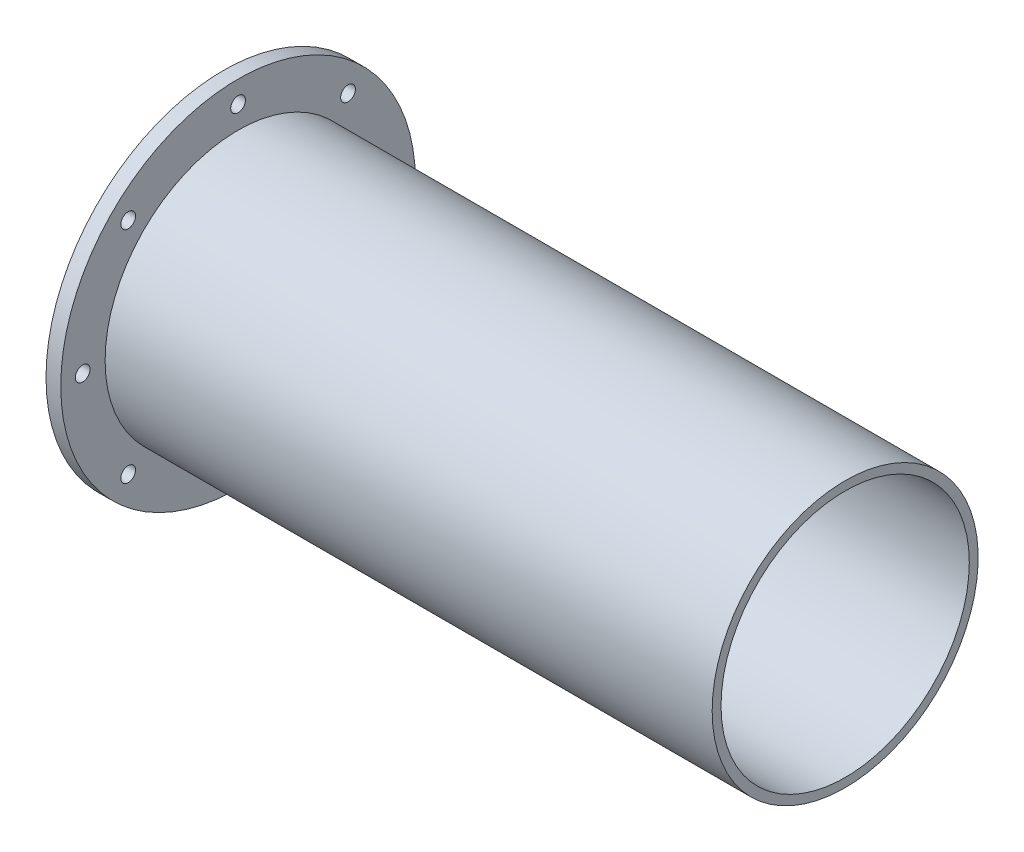
ISO-10303-21;
HEADER;
FILE_DESCRIPTION(('STEP AP214'),'2;1');
FILE_NAME('part.step','',(''),(''),'','','');
FILE_SCHEMA(('AUTOMOTIVE_DESIGN { 1 0 10303 214 1 1 1 1 }'));
ENDSEC;
DATA;
#1=APPLICATION_CONTEXT('core data for automotive mechanical design processes');
#2=APPLICATION_PROTOCOL_DEFINITION('international standard','automotive_design',2000,#1);
#3=PRODUCT_CONTEXT('',#1,'mechanical');
#4=PRODUCT('Part','Part','',(#3));
#5=PRODUCT_RELATED_PRODUCT_CATEGORY('part','',(#4));
#6=PRODUCT_DEFINITION_FORMATION('','',#4);
#7=PRODUCT_DEFINITION_CONTEXT('part definition',#1,'design');
#8=PRODUCT_DEFINITION('design','',#6,#7);
#9=PRODUCT_DEFINITION_SHAPE('','',#8);
#10=(LENGTH_UNIT() NAMED_UNIT(*) SI_UNIT(.MILLI.,.METRE.));
#11=(NAMED_UNIT(*) PLANE_ANGLE_UNIT() SI_UNIT($,.RADIAN.));
#12=(NAMED_UNIT(*) SI_UNIT($,.STERADIAN.) SOLID_ANGLE_UNIT());
#13=UNCERTAINTY_MEASURE_WITH_UNIT(LENGTH_MEASURE(1.E-05),#10,'distance_accuracy_value','');
#14=(GEOMETRIC_REPRESENTATION_CONTEXT(3) GLOBAL_UNCERTAINTY_ASSIGNED_CONTEXT((#13)) GLOBAL_UNIT_ASSIGNED_CONTEXT((#10,
#11,#12)) REPRESENTATION_CONTEXT('',''));
#15=CARTESIAN_POINT('',(0.,0.,0.));
#16=DIRECTION('',(0.,0.,1.));
#17=DIRECTION('',(1.,0.,0.));
#18=AXIS2_PLACEMENT_3D('',#15,#16,#17);
#19=CARTESIAN_POINT('',(0.,76.2,0.));
#20=DIRECTION('',(1.,0.,0.));
#21=DIRECTION('',(0.,0.,-1.));
#22=AXIS2_PLACEMENT_3D('',#19,#20,#21);
#23=PLANE('',#22);
#24=CARTESIAN_POINT('',(0.,-66.802,2.33237936397399E-13));
#25=DIRECTION('',(1.,0.,0.));
#26=DIRECTION('',(0.,-1.,0.));
#27=AXIS2_PLACEMENT_3D('',#24,#25,#26);
#28=CIRCLE('',#27,3.175);
#29=CARTESIAN_POINT('',(0.,-69.977,2.44323389648226E-13));
#30=VERTEX_POINT('',#29);
#31=EDGE_CURVE('E70',#30,#30,#28,.T.);
#32=ORIENTED_EDGE('',*,*,#31,.T.);
#33=EDGE_LOOP('',(#32));
#34=FACE_BOUND('',#33,.T.);
#35=CARTESIAN_POINT('',(0.,-47.2361471968235,47.236147196824));
#36=DIRECTION('',(1.,0.,0.));
#37=DIRECTION('',(0.,-0.707106781186544,0.707106781186551));
#38=AXIS2_PLACEMENT_3D('',#35,#36,#37);
#39=CIRCLE('',#38,3.175);
#40=CARTESIAN_POINT('',(0.,-49.4812112270908,49.4812112270913));
#41=VERTEX_POINT('',#40);
#42=EDGE_CURVE('E89',#41,#41,#39,.T.);
#43=ORIENTED_EDGE('',*,*,#42,.T.);
#44=EDGE_LOOP('',(#43));
#45=FACE_BOUND('',#44,.T.);
#46=CARTESIAN_POINT('',(0.,0.,66.802));
#47=DIRECTION('',(1.,0.,0.));
#48=DIRECTION('',(0.,0.,1.));
#49=AXIS2_PLACEMENT_3D('',#46,#47,#48);
#50=CIRCLE('',#49,3.175);
#51=CARTESIAN_POINT('',(0.,0.,69.977));
#52=VERTEX_POINT('',#51);
#53=EDGE_CURVE('E83',#52,#52,#50,.T.);
#54=ORIENTED_EDGE('',*,*,#53,.T.);
#55=EDGE_LOOP('',(#54));
#56=FACE_BOUND('',#55,.T.);
#57=CARTESIAN_POINT('',(0.,47.2361471968242,47.2361471968233));
#58=DIRECTION('',(1.,0.,0.));
#59=DIRECTION('',(0.,0.707106781186554,0.707106781186541));
#60=AXIS2_PLACEMENT_3D('',#57,#58,#59);
#61=CIRCLE('',#60,3.175);
#62=CARTESIAN_POINT('',(0.,49.4812112270915,49.4812112270906));
#63=VERTEX_POINT('',#62);
#64=EDGE_CURVE('E76',#63,#63,#61,.T.);
#65=ORIENTED_EDGE('',*,*,#64,.T.);
#66=EDGE_LOOP('',(#65));
#67=FACE_BOUND('',#66,.T.);
#68=CARTESIAN_POINT('',(0.,66.802,-6.99713809192197E-13));
#69=DIRECTION('',(1.,0.,0.));
#70=DIRECTION('',(0.,1.,0.));
#71=AXIS2_PLACEMENT_3D('',#68,#69,#70);
#72=CIRCLE('',#71,3.175);
#73=CARTESIAN_POINT('',(0.,69.977,-7.32970168944678E-13));
#74=VERTEX_POINT('',#73);
#75=EDGE_CURVE('E77',#74,#74,#72,.T.);
#76=ORIENTED_EDGE('',*,*,#75,.T.);
#77=EDGE_LOOP('',(#76));
#78=FACE_BOUND('',#77,.T.);
#79=CARTESIAN_POINT('',(0.,47.2361471968232,-47.2361471968243));
#80=DIRECTION('',(1.,0.,0.));
#81=DIRECTION('',(0.,0.707106781186539,-0.707106781186556));
#82=AXIS2_PLACEMENT_3D('',#79,#80,#81);
#83=CIRCLE('',#82,3.175);
#84=CARTESIAN_POINT('',(0.,49.4812112270904,-49.4812112270916));
#85=VERTEX_POINT('',#84);
#86=EDGE_CURVE('E100',#85,#85,#83,.T.);
#87=ORIENTED_EDGE('',*,*,#86,.T.);
#88=EDGE_LOOP('',(#87));
#89=FACE_BOUND('',#88,.T.);
#90=CARTESIAN_POINT('',(0.,-47.2361471968238,-47.2361471968237));
#91=DIRECTION('',(1.,0.,0.));
#92=DIRECTION('',(0.,-0.707106781186549,-0.707106781186546));
#93=AXIS2_PLACEMENT_3D('',#90,#91,#92);
#94=CIRCLE('',#93,3.175);
#95=CARTESIAN_POINT('',(0.,-49.4812112270911,-49.481211227091));
#96=VERTEX_POINT('',#95);
#97=EDGE_CURVE('E64',#96,#96,#94,.T.);
#98=ORIENTED_EDGE('',*,*,#97,.T.);
#99=EDGE_LOOP('',(#98));
#100=FACE_BOUND('',#99,.T.);
#101=CARTESIAN_POINT('',(0.,0.,-66.802));
#102=DIRECTION('',(1.,0.,0.));
#103=DIRECTION('',(0.,0.,-1.));
#104=AXIS2_PLACEMENT_3D('',#101,#102,#103);
#105=CIRCLE('',#104,3.175);
#106=CARTESIAN_POINT('',(0.,0.,-69.977));
#107=VERTEX_POINT('',#106);
#108=EDGE_CURVE('E60',#107,#107,#105,.T.);
#109=ORIENTED_EDGE('',*,*,#108,.T.);
#110=EDGE_LOOP('',(#109));
#111=FACE_BOUND('',#110,.T.);
#112=CARTESIAN_POINT('',(0.,0.,0.));
#113=DIRECTION('',(-1.,0.,0.));
#114=DIRECTION('',(0.,0.,1.));
#115=AXIS2_PLACEMENT_3D('',#112,#113,#114);
#116=CIRCLE('',#115,53.34);
#117=CARTESIAN_POINT('',(0.,0.,53.34));
#118=VERTEX_POINT('',#117);
#119=EDGE_CURVE('E57',#118,#118,#116,.T.);
#120=ORIENTED_EDGE('',*,*,#119,.F.);
#121=EDGE_LOOP('',(#120));
#122=FACE_BOUND('',#121,.T.);
#123=CARTESIAN_POINT('',(0.,0.,0.));
#124=DIRECTION('',(-1.,0.,0.));
#125=DIRECTION('',(0.,0.,1.));
#126=AXIS2_PLACEMENT_3D('',#123,#124,#125);
#127=CIRCLE('',#126,76.2);
#128=CARTESIAN_POINT('',(0.,0.,76.2));
#129=VERTEX_POINT('',#128);
#130=EDGE_CURVE('E10',#129,#129,#127,.T.);
#131=ORIENTED_EDGE('',*,*,#130,.T.);
#132=EDGE_LOOP('',(#131));
#133=FACE_BOUND('',#132,.T.);
#134=ADVANCED_FACE('F35',(#34,#45,#56,#67,#78,#89,#100,#111,#122,#133),#23,.F.);
#135=CARTESIAN_POINT('',(0.,0.,0.));
#136=DIRECTION('',(-1.,0.,0.));
#137=DIRECTION('',(0.,0.,1.));
#138=AXIS2_PLACEMENT_3D('',#135,#136,#137);
#139=CYLINDRICAL_SURFACE('',#138,76.2);
#140=ORIENTED_EDGE('',*,*,#130,.F.);
#141=EDGE_LOOP('',(#140));
#142=FACE_BOUND('',#141,.T.);
#143=CARTESIAN_POINT('',(6.35000000000001,0.,0.));
#144=DIRECTION('',(-1.,0.,0.));
#145=DIRECTION('',(0.,0.,1.));
#146=AXIS2_PLACEMENT_3D('',#143,#144,#145);
#147=CIRCLE('',#146,76.2);
#148=CARTESIAN_POINT('',(6.35000000000001,0.,76.2));
#149=VERTEX_POINT('',#148);
#150=EDGE_CURVE('E41',#149,#149,#147,.T.);
#151=ORIENTED_EDGE('',*,*,#150,.T.);
#152=EDGE_LOOP('',(#151));
#153=FACE_BOUND('',#152,.T.);
#154=ADVANCED_FACE('F123',(#142,#153),#139,.T.);
#155=CARTESIAN_POINT('',(6.35000000000001,76.2,0.));
#156=DIRECTION('',(-1.,0.,0.));
#157=DIRECTION('',(0.,0.,1.));
#158=AXIS2_PLACEMENT_3D('',#155,#156,#157);
#159=PLANE('',#158);
#160=CARTESIAN_POINT('',(6.35000000000001,-66.802,2.33237936397399E-13));
#161=DIRECTION('',(1.,0.,0.));
#162=DIRECTION('',(0.,-1.,0.));
#163=AXIS2_PLACEMENT_3D('',#160,#161,#162);
#164=CIRCLE('',#163,3.175);
#165=CARTESIAN_POINT('',(6.35000000000001,-69.977,2.44323389648226E-13));
#166=VERTEX_POINT('',#165);
#167=EDGE_CURVE('E92',#166,#166,#164,.T.);
#168=ORIENTED_EDGE('',*,*,#167,.F.);
#169=EDGE_LOOP('',(#168));
#170=FACE_BOUND('',#169,.T.);
#171=CARTESIAN_POINT('',(6.35000000000001,-47.2361471968235,47.236147196824));
#172=DIRECTION('',(1.,0.,0.));
#173=DIRECTION('',(0.,-0.707106781186544,0.707106781186551));
#174=AXIS2_PLACEMENT_3D('',#171,#172,#173);
#175=CIRCLE('',#174,3.175);
#176=CARTESIAN_POINT('',(6.35000000000001,-49.4812112270908,49.4812112270913));
#177=VERTEX_POINT('',#176);
#178=EDGE_CURVE('E86',#177,#177,#175,.T.);
#179=ORIENTED_EDGE('',*,*,#178,.F.);
#180=EDGE_LOOP('',(#179));
#181=FACE_BOUND('',#180,.T.);
#182=CARTESIAN_POINT('',(6.35000000000001,0.,66.802));
#183=DIRECTION('',(1.,0.,0.));
#184=DIRECTION('',(0.,0.,1.));
#185=AXIS2_PLACEMENT_3D('',#182,#183,#184);
#186=CIRCLE('',#185,3.175);
#187=CARTESIAN_POINT('',(6.35000000000001,0.,69.977));
#188=VERTEX_POINT('',#187);
#189=EDGE_CURVE('E80',#188,#188,#186,.T.);
#190=ORIENTED_EDGE('',*,*,#189,.F.);
#191=EDGE_LOOP('',(#190));
#192=FACE_BOUND('',#191,.T.);
#193=CARTESIAN_POINT('',(6.35000000000001,47.2361471968242,47.2361471968233));
#194=DIRECTION('',(1.,0.,0.));
#195=DIRECTION('',(0.,0.707106781186554,0.707106781186541));
#196=AXIS2_PLACEMENT_3D('',#193,#194,#195);
#197=CIRCLE('',#196,3.175);
#198=CARTESIAN_POINT('',(6.35000000000001,49.4812112270915,49.4812112270906));
#199=VERTEX_POINT('',#198);
#200=EDGE_CURVE('E73',#199,#199,#197,.T.);
#201=ORIENTED_EDGE('',*,*,#200,.F.);
#202=EDGE_LOOP('',(#201));
#203=FACE_BOUND('',#202,.T.);
#204=CARTESIAN_POINT('',(6.35000000000001,66.802,-6.99713809192197E-13));
#205=DIRECTION('',(1.,0.,0.));
#206=DIRECTION('',(0.,1.,0.));
#207=AXIS2_PLACEMENT_3D('',#204,#205,#206);
#208=CIRCLE('',#207,3.175);
#209=CARTESIAN_POINT('',(6.35000000000001,69.977,-7.32970168944678E-13));
#210=VERTEX_POINT('',#209);
#211=EDGE_CURVE('E103',#210,#210,#208,.T.);
#212=ORIENTED_EDGE('',*,*,#211,.F.);
#213=EDGE_LOOP('',(#212));
#214=FACE_BOUND('',#213,.T.);
#215=CARTESIAN_POINT('',(6.35000000000001,47.2361471968232,-47.2361471968243));
#216=DIRECTION('',(1.,0.,0.));
#217=DIRECTION('',(0.,0.707106781186539,-0.707106781186556));
#218=AXIS2_PLACEMENT_3D('',#215,#216,#217);
#219=CIRCLE('',#218,3.175);
#220=CARTESIAN_POINT('',(6.35000000000001,49.4812112270904,-49.4812112270916));
#221=VERTEX_POINT('',#220);
#222=EDGE_CURVE('E97',#221,#221,#219,.T.);
#223=ORIENTED_EDGE('',*,*,#222,.F.);
#224=EDGE_LOOP('',(#223));
#225=FACE_BOUND('',#224,.T.);
#226=CARTESIAN_POINT('',(6.35000000000001,-47.2361471968238,-47.2361471968237));
#227=DIRECTION('',(1.,0.,0.));
#228=DIRECTION('',(0.,-0.707106781186549,-0.707106781186546));
#229=AXIS2_PLACEMENT_3D('',#226,#227,#228);
#230=CIRCLE('',#229,3.175);
#231=CARTESIAN_POINT('',(6.35000000000001,-49.4812112270911,-49.481211227091));
#232=VERTEX_POINT('',#231);
#233=EDGE_CURVE('E67',#232,#232,#230,.T.);
#234=ORIENTED_EDGE('',*,*,#233,.F.);
#235=EDGE_LOOP('',(#234));
#236=FACE_BOUND('',#235,.T.);
#237=CARTESIAN_POINT('',(6.35000000000001,0.,-66.802));
#238=DIRECTION('',(1.,0.,0.));
#239=DIRECTION('',(0.,0.,-1.));
#240=AXIS2_PLACEMENT_3D('',#237,#238,#239);
#241=CIRCLE('',#240,3.175);
#242=CARTESIAN_POINT('',(6.35000000000001,0.,-69.977));
#243=VERTEX_POINT('',#242);
#244=EDGE_CURVE('E61',#243,#243,#241,.T.);
#245=ORIENTED_EDGE('',*,*,#244,.F.);
#246=EDGE_LOOP('',(#245));
#247=FACE_BOUND('',#246,.T.);
#248=ORIENTED_EDGE('',*,*,#150,.F.);
#249=EDGE_LOOP('',(#248));
#250=FACE_BOUND('',#249,.T.);
#251=CARTESIAN_POINT('',(6.35000000000001,0.,0.));
#252=DIRECTION('',(-1.,0.,0.));
#253=DIRECTION('',(0.,0.,1.));
#254=AXIS2_PLACEMENT_3D('',#251,#252,#253);
#255=CIRCLE('',#254,57.15);
#256=CARTESIAN_POINT('',(6.35000000000001,0.,57.15));
#257=VERTEX_POINT('',#256);
#258=EDGE_CURVE('E45',#257,#257,#255,.T.);
#259=ORIENTED_EDGE('',*,*,#258,.T.);
#260=EDGE_LOOP('',(#259));
#261=FACE_BOUND('',#260,.T.);
#262=ADVANCED_FACE('F119',(#170,#181,#192,#203,#214,#225,#236,#247,#250,#261),#159,.F.);
#263=CARTESIAN_POINT('',(0.,0.,0.));
#264=DIRECTION('',(-1.,0.,0.));
#265=DIRECTION('',(0.,0.,1.));
#266=AXIS2_PLACEMENT_3D('',#263,#264,#265);
#267=CYLINDRICAL_SURFACE('',#266,57.15);
#268=ORIENTED_EDGE('',*,*,#258,.F.);
#269=EDGE_LOOP('',(#268));
#270=FACE_BOUND('',#269,.T.);
#271=CARTESIAN_POINT('',(267.208,0.,0.));
#272=DIRECTION('',(-1.,0.,0.));
#273=DIRECTION('',(0.,0.,1.));
#274=AXIS2_PLACEMENT_3D('',#271,#272,#273);
#275=CIRCLE('',#274,57.15);
#276=CARTESIAN_POINT('',(267.208,0.,57.15));
#277=VERTEX_POINT('',#276);
#278=EDGE_CURVE('E49',#277,#277,#275,.T.);
#279=ORIENTED_EDGE('',*,*,#278,.T.);
#280=EDGE_LOOP('',(#279));
#281=FACE_BOUND('',#280,.T.);
#282=ADVANCED_FACE('F122',(#270,#281),#267,.T.);
#283=CARTESIAN_POINT('',(267.208,57.15,0.));
#284=DIRECTION('',(-1.,0.,0.));
#285=DIRECTION('',(0.,0.,1.));
#286=AXIS2_PLACEMENT_3D('',#283,#284,#285);
#287=PLANE('',#286);
#288=ORIENTED_EDGE('',*,*,#278,.F.);
#289=EDGE_LOOP('',(#288));
#290=FACE_BOUND('',#289,.T.);
#291=CARTESIAN_POINT('',(267.208,0.,0.));
#292=DIRECTION('',(-1.,0.,0.));
#293=DIRECTION('',(0.,0.,1.));
#294=AXIS2_PLACEMENT_3D('',#291,#292,#293);
#295=CIRCLE('',#294,53.34);
#296=CARTESIAN_POINT('',(267.208,0.,53.34));
#297=VERTEX_POINT('',#296);
#298=EDGE_CURVE('E54',#297,#297,#295,.T.);
#299=ORIENTED_EDGE('',*,*,#298,.T.);
#300=EDGE_LOOP('',(#299));
#301=FACE_BOUND('',#300,.T.);
#302=ADVANCED_FACE('F137',(#290,#301),#287,.F.);
#303=CARTESIAN_POINT('',(0.,0.,0.));
#304=DIRECTION('',(-1.,0.,0.));
#305=DIRECTION('',(0.,0.,1.));
#306=AXIS2_PLACEMENT_3D('',#303,#304,#305);
#307=CYLINDRICAL_SURFACE('',#306,53.34);
#308=ORIENTED_EDGE('',*,*,#298,.F.);
#309=EDGE_LOOP('',(#308));
#310=FACE_BOUND('',#309,.T.);
#311=ORIENTED_EDGE('',*,*,#119,.T.);
#312=EDGE_LOOP('',(#311));
#313=FACE_BOUND('',#312,.T.);
#314=ADVANCED_FACE('F143',(#310,#313),#307,.F.);
#315=CARTESIAN_POINT('',(0.,0.,-66.802));
#316=DIRECTION('',(1.,0.,0.));
#317=DIRECTION('',(0.,0.,-1.));
#318=AXIS2_PLACEMENT_3D('',#315,#316,#317);
#319=CYLINDRICAL_SURFACE('',#318,3.175);
#320=ORIENTED_EDGE('',*,*,#108,.F.);
#321=EDGE_LOOP('',(#320));
#322=FACE_BOUND('',#321,.T.);
#323=ORIENTED_EDGE('',*,*,#244,.T.);
#324=EDGE_LOOP('',(#323));
#325=FACE_BOUND('',#324,.T.);
#326=ADVANCED_FACE('F149',(#322,#325),#319,.F.);
#327=CARTESIAN_POINT('',(0.,-47.2361471968238,-47.2361471968237));
#328=DIRECTION('',(1.,0.,0.));
#329=DIRECTION('',(0.,0.,-1.));
#330=AXIS2_PLACEMENT_3D('',#327,#328,#329);
#331=CYLINDRICAL_SURFACE('',#330,3.175);
#332=ORIENTED_EDGE('',*,*,#97,.F.);
#333=EDGE_LOOP('',(#332));
#334=FACE_BOUND('',#333,.T.);
#335=ORIENTED_EDGE('',*,*,#233,.T.);
#336=EDGE_LOOP('',(#335));
#337=FACE_BOUND('',#336,.T.);
#338=ADVANCED_FACE('F181',(#334,#337),#331,.F.);
#339=CARTESIAN_POINT('',(0.,47.2361471968232,-47.2361471968243));
#340=DIRECTION('',(1.,0.,0.));
#341=DIRECTION('',(0.,0.,-1.));
#342=AXIS2_PLACEMENT_3D('',#339,#340,#341);
#343=CYLINDRICAL_SURFACE('',#342,3.175);
#344=ORIENTED_EDGE('',*,*,#86,.F.);
#345=EDGE_LOOP('',(#344));
#346=FACE_BOUND('',#345,.T.);
#347=ORIENTED_EDGE('',*,*,#222,.T.);
#348=EDGE_LOOP('',(#347));
#349=FACE_BOUND('',#348,.T.);
#350=ADVANCED_FACE('F115',(#346,#349),#343,.F.);
#351=CARTESIAN_POINT('',(0.,66.802,-6.99713809192197E-13));
#352=DIRECTION('',(1.,0.,0.));
#353=DIRECTION('',(0.,0.,-1.));
#354=AXIS2_PLACEMENT_3D('',#351,#352,#353);
#355=CYLINDRICAL_SURFACE('',#354,3.175);
#356=ORIENTED_EDGE('',*,*,#75,.F.);
#357=EDGE_LOOP('',(#356));
#358=FACE_BOUND('',#357,.T.);
#359=ORIENTED_EDGE('',*,*,#211,.T.);
#360=EDGE_LOOP('',(#359));
#361=FACE_BOUND('',#360,.T.);
#362=ADVANCED_FACE('F111',(#358,#361),#355,.F.);
#363=CARTESIAN_POINT('',(0.,47.2361471968242,47.2361471968233));
#364=DIRECTION('',(1.,0.,0.));
#365=DIRECTION('',(0.,0.,-1.));
#366=AXIS2_PLACEMENT_3D('',#363,#364,#365);
#367=CYLINDRICAL_SURFACE('',#366,3.175);
#368=ORIENTED_EDGE('',*,*,#64,.F.);
#369=EDGE_LOOP('',(#368));
#370=FACE_BOUND('',#369,.T.);
#371=ORIENTED_EDGE('',*,*,#200,.T.);
#372=EDGE_LOOP('',(#371));
#373=FACE_BOUND('',#372,.T.);
#374=ADVANCED_FACE('F114',(#370,#373),#367,.F.);
#375=CARTESIAN_POINT('',(0.,0.,66.802));
#376=DIRECTION('',(1.,0.,0.));
#377=DIRECTION('',(0.,0.,-1.));
#378=AXIS2_PLACEMENT_3D('',#375,#376,#377);
#379=CYLINDRICAL_SURFACE('',#378,3.175);
#380=ORIENTED_EDGE('',*,*,#53,.F.);
#381=EDGE_LOOP('',(#380));
#382=FACE_BOUND('',#381,.T.);
#383=ORIENTED_EDGE('',*,*,#189,.T.);
#384=EDGE_LOOP('',(#383));
#385=FACE_BOUND('',#384,.T.);
#386=ADVANCED_FACE('F169',(#382,#385),#379,.F.);
#387=CARTESIAN_POINT('',(0.,-47.2361471968235,47.236147196824));
#388=DIRECTION('',(1.,0.,0.));
#389=DIRECTION('',(0.,0.,-1.));
#390=AXIS2_PLACEMENT_3D('',#387,#388,#389);
#391=CYLINDRICAL_SURFACE('',#390,3.175);
#392=ORIENTED_EDGE('',*,*,#42,.F.);
#393=EDGE_LOOP('',(#392));
#394=FACE_BOUND('',#393,.T.);
#395=ORIENTED_EDGE('',*,*,#178,.T.);
#396=EDGE_LOOP('',(#395));
#397=FACE_BOUND('',#396,.T.);
#398=ADVANCED_FACE('F176',(#394,#397),#391,.F.);
#399=CARTESIAN_POINT('',(0.,-66.802,2.33237936397399E-13));
#400=DIRECTION('',(1.,0.,0.));
#401=DIRECTION('',(0.,0.,-1.));
#402=AXIS2_PLACEMENT_3D('',#399,#400,#401);
#403=CYLINDRICAL_SURFACE('',#402,3.175);
#404=ORIENTED_EDGE('',*,*,#31,.F.);
#405=EDGE_LOOP('',(#404));
#406=FACE_BOUND('',#405,.T.);
#407=ORIENTED_EDGE('',*,*,#167,.T.);
#408=EDGE_LOOP('',(#407));
#409=FACE_BOUND('',#408,.T.);
#410=ADVANCED_FACE('F229',(#406,#409),#403,.F.);
#411=CLOSED_SHELL('',(#134,#154,#262,#282,#302,#314,#326,#338,#350,#362,#374,#386,#398,#410));
#412=MANIFOLD_SOLID_BREP('B2',#411);
#413=ADVANCED_BREP_SHAPE_REPRESENTATION('',(#18,#412),#14);
#414=SHAPE_DEFINITION_REPRESENTATION(#9,#413);
ENDSEC;
END-ISO-10303-21;
